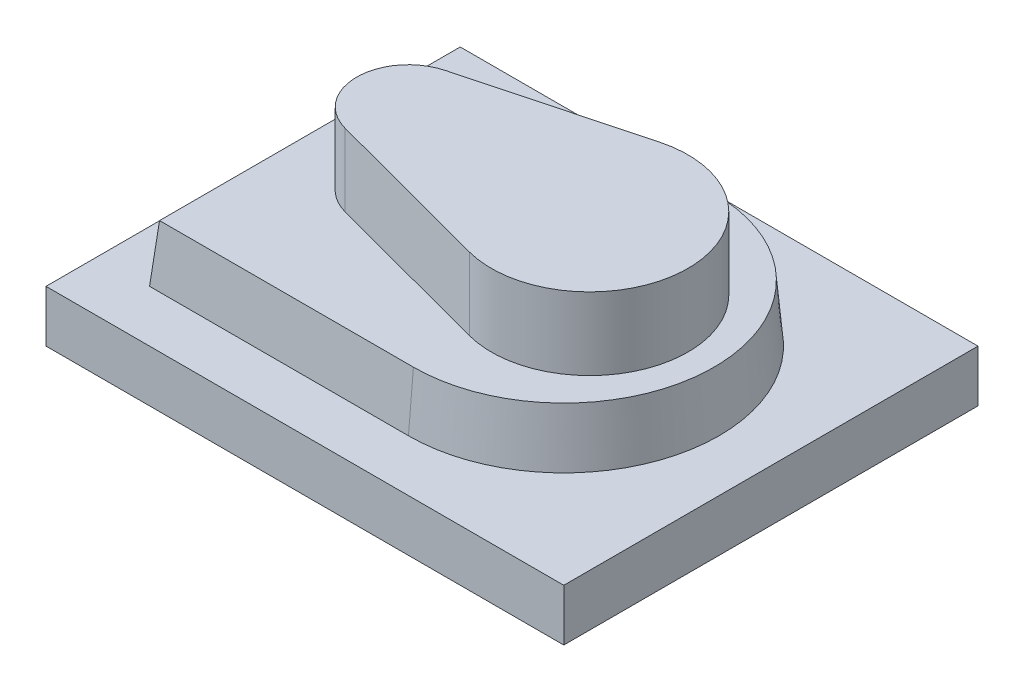
ISO-10303-21;
HEADER;
FILE_DESCRIPTION(('STEP AP214'),'2;1');
FILE_NAME('part.step','',(''),(''),'','','');
FILE_SCHEMA(('AUTOMOTIVE_DESIGN { 1 0 10303 214 1 1 1 1 }'));
ENDSEC;
DATA;
#1=APPLICATION_CONTEXT('core data for automotive mechanical design processes');
#2=APPLICATION_PROTOCOL_DEFINITION('international standard','automotive_design',2000,#1);
#3=PRODUCT_CONTEXT('',#1,'mechanical');
#4=PRODUCT('Part','Part','',(#3));
#5=PRODUCT_RELATED_PRODUCT_CATEGORY('part','',(#4));
#6=PRODUCT_DEFINITION_FORMATION('','',#4);
#7=PRODUCT_DEFINITION_CONTEXT('part definition',#1,'design');
#8=PRODUCT_DEFINITION('design','',#6,#7);
#9=PRODUCT_DEFINITION_SHAPE('','',#8);
#10=(LENGTH_UNIT() NAMED_UNIT(*) SI_UNIT(.MILLI.,.METRE.));
#11=(NAMED_UNIT(*) PLANE_ANGLE_UNIT() SI_UNIT($,.RADIAN.));
#12=(NAMED_UNIT(*) SI_UNIT($,.STERADIAN.) SOLID_ANGLE_UNIT());
#13=UNCERTAINTY_MEASURE_WITH_UNIT(LENGTH_MEASURE(1.E-05),#10,'distance_accuracy_value','');
#14=(GEOMETRIC_REPRESENTATION_CONTEXT(3) GLOBAL_UNCERTAINTY_ASSIGNED_CONTEXT((#13)) GLOBAL_UNIT_ASSIGNED_CONTEXT((#10,
#11,#12)) REPRESENTATION_CONTEXT('',''));
#15=CARTESIAN_POINT('',(0.,0.,0.));
#16=DIRECTION('',(0.,0.,1.));
#17=DIRECTION('',(1.,0.,0.));
#18=AXIS2_PLACEMENT_3D('',#15,#16,#17);
#19=CARTESIAN_POINT('',(50.,10.,-40.));
#20=DIRECTION('',(-1.,0.,0.));
#21=DIRECTION('',(0.,0.,1.));
#22=AXIS2_PLACEMENT_3D('',#19,#20,#21);
#23=PLANE('',#22);
#24=DIRECTION('',(0.,0.,-1.));
#25=VECTOR('',#24,1.);
#26=CARTESIAN_POINT('',(50.,0.,-40.));
#27=LINE('',#26,#25);
#28=CARTESIAN_POINT('',(50.,0.,40.));
#29=VERTEX_POINT('',#28);
#30=CARTESIAN_POINT('',(50.,0.,-40.));
#31=VERTEX_POINT('',#30);
#32=EDGE_CURVE('E166',#29,#31,#27,.T.);
#33=ORIENTED_EDGE('',*,*,#32,.T.);
#34=DIRECTION('',(0.,-1.,0.));
#35=VECTOR('',#34,1.);
#36=CARTESIAN_POINT('',(50.,10.,-40.));
#37=LINE('',#36,#35);
#38=CARTESIAN_POINT('',(50.,10.,-40.));
#39=VERTEX_POINT('',#38);
#40=EDGE_CURVE('E11',#39,#31,#37,.T.);
#41=ORIENTED_EDGE('',*,*,#40,.F.);
#42=DIRECTION('',(0.,0.,-1.));
#43=VECTOR('',#42,1.);
#44=CARTESIAN_POINT('',(50.,10.,-40.));
#45=LINE('',#44,#43);
#46=CARTESIAN_POINT('',(50.,10.,40.));
#47=VERTEX_POINT('',#46);
#48=EDGE_CURVE('E184',#47,#39,#45,.T.);
#49=ORIENTED_EDGE('',*,*,#48,.F.);
#50=DIRECTION('',(0.,-1.,0.));
#51=VECTOR('',#50,1.);
#52=CARTESIAN_POINT('',(50.,10.,40.));
#53=LINE('',#52,#51);
#54=EDGE_CURVE('E194',#47,#29,#53,.T.);
#55=ORIENTED_EDGE('',*,*,#54,.T.);
#56=EDGE_LOOP('',(#33,#41,#49,#55));
#57=FACE_BOUND('',#56,.T.);
#58=ADVANCED_FACE('F37',(#57),#23,.F.);
#59=CARTESIAN_POINT('',(-50.,10.,-40.));
#60=DIRECTION('',(0.,0.,1.));
#61=DIRECTION('',(1.,0.,0.));
#62=AXIS2_PLACEMENT_3D('',#59,#60,#61);
#63=PLANE('',#62);
#64=DIRECTION('',(-1.,0.,0.));
#65=VECTOR('',#64,1.);
#66=CARTESIAN_POINT('',(-50.,0.,-40.));
#67=LINE('',#66,#65);
#68=CARTESIAN_POINT('',(-50.,0.,-40.));
#69=VERTEX_POINT('',#68);
#70=EDGE_CURVE('E197',#31,#69,#67,.T.);
#71=ORIENTED_EDGE('',*,*,#70,.T.);
#72=DIRECTION('',(0.,-1.,0.));
#73=VECTOR('',#72,1.);
#74=CARTESIAN_POINT('',(-50.,10.,-40.));
#75=LINE('',#74,#73);
#76=CARTESIAN_POINT('',(-50.,10.,-40.));
#77=VERTEX_POINT('',#76);
#78=EDGE_CURVE('E44',#77,#69,#75,.T.);
#79=ORIENTED_EDGE('',*,*,#78,.F.);
#80=DIRECTION('',(-1.,0.,0.));
#81=VECTOR('',#80,1.);
#82=CARTESIAN_POINT('',(-50.,10.,-40.));
#83=LINE('',#82,#81);
#84=EDGE_CURVE('E187',#39,#77,#83,.T.);
#85=ORIENTED_EDGE('',*,*,#84,.F.);
#86=ORIENTED_EDGE('',*,*,#40,.T.);
#87=EDGE_LOOP('',(#71,#79,#85,#86));
#88=FACE_BOUND('',#87,.T.);
#89=ADVANCED_FACE('F227',(#88),#63,.F.);
#90=CARTESIAN_POINT('',(-50.,10.,-40.));
#91=DIRECTION('',(1.,0.,0.));
#92=DIRECTION('',(0.,0.,-1.));
#93=AXIS2_PLACEMENT_3D('',#90,#91,#92);
#94=PLANE('',#93);
#95=DIRECTION('',(0.,0.,1.));
#96=VECTOR('',#95,1.);
#97=CARTESIAN_POINT('',(-50.,0.,-40.));
#98=LINE('',#97,#96);
#99=CARTESIAN_POINT('',(-50.,0.,40.));
#100=VERTEX_POINT('',#99);
#101=EDGE_CURVE('E199',#69,#100,#98,.T.);
#102=ORIENTED_EDGE('',*,*,#101,.T.);
#103=DIRECTION('',(0.,-1.,0.));
#104=VECTOR('',#103,1.);
#105=CARTESIAN_POINT('',(-50.,10.,40.));
#106=LINE('',#105,#104);
#107=CARTESIAN_POINT('',(-50.,10.,40.));
#108=VERTEX_POINT('',#107);
#109=EDGE_CURVE('E204',#108,#100,#106,.T.);
#110=ORIENTED_EDGE('',*,*,#109,.F.);
#111=DIRECTION('',(0.,0.,1.));
#112=VECTOR('',#111,1.);
#113=CARTESIAN_POINT('',(-50.,10.,-40.));
#114=LINE('',#113,#112);
#115=EDGE_CURVE('E190',#77,#108,#114,.T.);
#116=ORIENTED_EDGE('',*,*,#115,.F.);
#117=ORIENTED_EDGE('',*,*,#78,.T.);
#118=EDGE_LOOP('',(#102,#110,#116,#117));
#119=FACE_BOUND('',#118,.T.);
#120=ADVANCED_FACE('F211',(#119),#94,.F.);
#121=CARTESIAN_POINT('',(-50.,10.,40.));
#122=DIRECTION('',(0.,0.,-1.));
#123=DIRECTION('',(-1.,0.,0.));
#124=AXIS2_PLACEMENT_3D('',#121,#122,#123);
#125=PLANE('',#124);
#126=DIRECTION('',(1.,0.,0.));
#127=VECTOR('',#126,1.);
#128=CARTESIAN_POINT('',(-50.,0.,40.));
#129=LINE('',#128,#127);
#130=EDGE_CURVE('E188',#100,#29,#129,.T.);
#131=ORIENTED_EDGE('',*,*,#130,.T.);
#132=ORIENTED_EDGE('',*,*,#54,.F.);
#133=DIRECTION('',(1.,0.,0.));
#134=VECTOR('',#133,1.);
#135=CARTESIAN_POINT('',(-50.,10.,40.));
#136=LINE('',#135,#134);
#137=EDGE_CURVE('E192',#108,#47,#136,.T.);
#138=ORIENTED_EDGE('',*,*,#137,.F.);
#139=ORIENTED_EDGE('',*,*,#109,.T.);
#140=EDGE_LOOP('',(#131,#132,#138,#139));
#141=FACE_BOUND('',#140,.T.);
#142=ADVANCED_FACE('F220',(#141),#125,.F.);
#143=CARTESIAN_POINT('',(0.,10.,0.));
#144=DIRECTION('',(0.,1.,0.));
#145=DIRECTION('',(0.,0.,1.));
#146=AXIS2_PLACEMENT_3D('',#143,#144,#145);
#147=PLANE('',#146);
#148=CARTESIAN_POINT('',(10.,10.,0.));
#149=DIRECTION('',(0.,1.,0.));
#150=DIRECTION('',(0.,0.,1.));
#151=AXIS2_PLACEMENT_3D('',#148,#149,#150);
#152=CIRCLE('',#151,30.);
#153=CARTESIAN_POINT('',(10.,10.,30.));
#154=VERTEX_POINT('',#153);
#155=CARTESIAN_POINT('',(10.,10.,-30.));
#156=VERTEX_POINT('',#155);
#157=EDGE_CURVE('E145',#154,#156,#152,.T.);
#158=ORIENTED_EDGE('',*,*,#157,.F.);
#159=DIRECTION('',(1.,0.,0.));
#160=VECTOR('',#159,1.);
#161=CARTESIAN_POINT('',(-40.,10.,30.));
#162=LINE('',#161,#160);
#163=CARTESIAN_POINT('',(-40.,10.,30.));
#164=VERTEX_POINT('',#163);
#165=EDGE_CURVE('E159',#164,#154,#162,.T.);
#166=ORIENTED_EDGE('',*,*,#165,.F.);
#167=DIRECTION('',(0.,0.,1.));
#168=VECTOR('',#167,1.);
#169=CARTESIAN_POINT('',(-40.,10.,-30.));
#170=LINE('',#169,#168);
#171=CARTESIAN_POINT('',(-40.,10.,-30.));
#172=VERTEX_POINT('',#171);
#173=EDGE_CURVE('E156',#172,#164,#170,.T.);
#174=ORIENTED_EDGE('',*,*,#173,.F.);
#175=DIRECTION('',(-1.,0.,0.));
#176=VECTOR('',#175,1.);
#177=CARTESIAN_POINT('',(10.,10.,-30.));
#178=LINE('',#177,#176);
#179=EDGE_CURVE('E148',#156,#172,#178,.T.);
#180=ORIENTED_EDGE('',*,*,#179,.F.);
#181=EDGE_LOOP('',(#158,#166,#174,#180));
#182=FACE_BOUND('',#181,.T.);
#183=ORIENTED_EDGE('',*,*,#48,.T.);
#184=ORIENTED_EDGE('',*,*,#84,.T.);
#185=ORIENTED_EDGE('',*,*,#115,.T.);
#186=ORIENTED_EDGE('',*,*,#137,.T.);
#187=EDGE_LOOP('',(#183,#184,#185,#186));
#188=FACE_BOUND('',#187,.T.);
#189=ADVANCED_FACE('F226',(#182,#188),#147,.T.);
#190=CARTESIAN_POINT('',(0.,0.,0.));
#191=DIRECTION('',(0.,1.,0.));
#192=DIRECTION('',(0.,0.,1.));
#193=AXIS2_PLACEMENT_3D('',#190,#191,#192);
#194=PLANE('',#193);
#195=ORIENTED_EDGE('',*,*,#32,.F.);
#196=ORIENTED_EDGE('',*,*,#130,.F.);
#197=ORIENTED_EDGE('',*,*,#101,.F.);
#198=ORIENTED_EDGE('',*,*,#70,.F.);
#199=EDGE_LOOP('',(#195,#196,#197,#198));
#200=FACE_BOUND('',#199,.T.);
#201=ADVANCED_FACE('F217',(#200),#194,.F.);
#202=CARTESIAN_POINT('',(10.,10.,0.));
#203=DIRECTION('',(0.,-1.,0.));
#204=DIRECTION('',(0.,0.,1.));
#205=AXIS2_PLACEMENT_3D('',#202,#203,#204);
#206=CONICAL_SURFACE('',#205,30.,0.0872664625997167);
#207=ORIENTED_EDGE('',*,*,#157,.T.);
#208=DIRECTION('',(0.,-0.996194698091745,-0.0871557427476583));
#209=VECTOR('',#208,1.);
#210=CARTESIAN_POINT('',(10.,10.,-30.));
#211=LINE('',#210,#209);
#212=CARTESIAN_POINT('',(10.,21.,-29.0376247012148));
#213=VERTEX_POINT('',#212);
#214=EDGE_CURVE('E163',#213,#156,#211,.T.);
#215=ORIENTED_EDGE('',*,*,#214,.F.);
#216=CARTESIAN_POINT('',(10.,21.,0.));
#217=DIRECTION('',(0.,1.,0.));
#218=DIRECTION('',(0.,0.,1.));
#219=AXIS2_PLACEMENT_3D('',#216,#217,#218);
#220=CIRCLE('',#219,29.0376247012148);
#221=CARTESIAN_POINT('',(10.,21.,29.0376247012148));
#222=VERTEX_POINT('',#221);
#223=EDGE_CURVE('E162',#222,#213,#220,.T.);
#224=ORIENTED_EDGE('',*,*,#223,.F.);
#225=DIRECTION('',(0.,-0.996194698091745,0.0871557427476583));
#226=VECTOR('',#225,1.);
#227=CARTESIAN_POINT('',(10.,10.,30.));
#228=LINE('',#227,#226);
#229=EDGE_CURVE('E168',#222,#154,#228,.T.);
#230=ORIENTED_EDGE('',*,*,#229,.T.);
#231=EDGE_LOOP('',(#207,#215,#224,#230));
#232=FACE_BOUND('',#231,.T.);
#233=ADVANCED_FACE('F239',(#232),#206,.T.);
#234=CARTESIAN_POINT('',(10.,10.,-30.));
#235=DIRECTION('',(0.,0.0871557427476584,-0.996194698091745));
#236=DIRECTION('',(0.,0.996194698091746,0.0871557427476584));
#237=AXIS2_PLACEMENT_3D('',#234,#235,#236);
#238=PLANE('',#237);
#239=ORIENTED_EDGE('',*,*,#179,.T.);
#240=DIRECTION('',(-0.0868265938642478,-0.992432509138967,-0.0868265938642478));
#241=VECTOR('',#240,1.);
#242=CARTESIAN_POINT('',(-40.,10.,-30.));
#243=LINE('',#242,#241);
#244=CARTESIAN_POINT('',(-39.0376247012148,21.,-29.0376247012148));
#245=VERTEX_POINT('',#244);
#246=EDGE_CURVE('E167',#245,#172,#243,.T.);
#247=ORIENTED_EDGE('',*,*,#246,.F.);
#248=DIRECTION('',(1.,0.,0.));
#249=VECTOR('',#248,1.);
#250=CARTESIAN_POINT('',(10.,21.,-29.0376247012148));
#251=LINE('',#250,#249);
#252=EDGE_CURVE('E179',#213,#245,#251,.F.);
#253=ORIENTED_EDGE('',*,*,#252,.F.);
#254=ORIENTED_EDGE('',*,*,#214,.T.);
#255=EDGE_LOOP('',(#239,#247,#253,#254));
#256=FACE_BOUND('',#255,.T.);
#257=ADVANCED_FACE('F243',(#256),#238,.T.);
#258=CARTESIAN_POINT('',(-40.,10.,-30.));
#259=DIRECTION('',(-0.996194698091746,0.0871557427476584,0.));
#260=DIRECTION('',(-0.0871557427476584,-0.996194698091746,0.));
#261=AXIS2_PLACEMENT_3D('',#258,#259,#260);
#262=PLANE('',#261);
#263=ORIENTED_EDGE('',*,*,#173,.T.);
#264=DIRECTION('',(-0.0868265938642478,-0.992432509138967,0.0868265938642478));
#265=VECTOR('',#264,1.);
#266=CARTESIAN_POINT('',(-40.,10.,30.));
#267=LINE('',#266,#265);
#268=CARTESIAN_POINT('',(-39.0376247012148,21.,29.0376247012148));
#269=VERTEX_POINT('',#268);
#270=EDGE_CURVE('E171',#269,#164,#267,.T.);
#271=ORIENTED_EDGE('',*,*,#270,.F.);
#272=DIRECTION('',(0.,0.,-1.));
#273=VECTOR('',#272,1.);
#274=CARTESIAN_POINT('',(-39.0376247012148,21.,-30.));
#275=LINE('',#274,#273);
#276=EDGE_CURVE('E181',#245,#269,#275,.F.);
#277=ORIENTED_EDGE('',*,*,#276,.F.);
#278=ORIENTED_EDGE('',*,*,#246,.T.);
#279=EDGE_LOOP('',(#263,#271,#277,#278));
#280=FACE_BOUND('',#279,.T.);
#281=ADVANCED_FACE('F246',(#280),#262,.T.);
#282=CARTESIAN_POINT('',(-40.,10.,30.));
#283=DIRECTION('',(0.,0.0871557427476584,0.996194698091746));
#284=DIRECTION('',(0.,-0.996194698091746,0.0871557427476584));
#285=AXIS2_PLACEMENT_3D('',#282,#283,#284);
#286=PLANE('',#285);
#287=ORIENTED_EDGE('',*,*,#165,.T.);
#288=ORIENTED_EDGE('',*,*,#229,.F.);
#289=DIRECTION('',(-1.,0.,0.));
#290=VECTOR('',#289,1.);
#291=CARTESIAN_POINT('',(-40.,21.,29.0376247012148));
#292=LINE('',#291,#290);
#293=EDGE_CURVE('E172',#269,#222,#292,.F.);
#294=ORIENTED_EDGE('',*,*,#293,.F.);
#295=ORIENTED_EDGE('',*,*,#270,.T.);
#296=EDGE_LOOP('',(#287,#288,#294,#295));
#297=FACE_BOUND('',#296,.T.);
#298=ADVANCED_FACE('F250',(#297),#286,.T.);
#299=CARTESIAN_POINT('',(10.,21.,0.));
#300=DIRECTION('',(0.,1.,0.));
#301=DIRECTION('',(0.,0.,1.));
#302=AXIS2_PLACEMENT_3D('',#299,#300,#301);
#303=PLANE('',#302);
#304=CARTESIAN_POINT('',(-20.,21.,0.));
#305=DIRECTION('',(0.,1.,0.));
#306=DIRECTION('',(0.,0.,1.));
#307=AXIS2_PLACEMENT_3D('',#304,#305,#306);
#308=CIRCLE('',#307,10.);
#309=CARTESIAN_POINT('',(-22.5714285714286,21.,-9.66373401445015));
#310=VERTEX_POINT('',#309);
#311=CARTESIAN_POINT('',(-22.5714285714286,21.,9.66373401445015));
#312=VERTEX_POINT('',#311);
#313=EDGE_CURVE('E51',#310,#312,#308,.T.);
#314=ORIENTED_EDGE('',*,*,#313,.F.);
#315=DIRECTION('',(-0.966373401445015,0.,0.257142857142857));
#316=VECTOR('',#315,1.);
#317=CARTESIAN_POINT('',(-22.5714285714286,21.,-9.66373401445015));
#318=LINE('',#317,#316);
#319=CARTESIAN_POINT('',(10.1142857142857,21.,-18.3610946274553));
#320=VERTEX_POINT('',#319);
#321=EDGE_CURVE('E55',#320,#310,#318,.T.);
#322=ORIENTED_EDGE('',*,*,#321,.F.);
#323=CARTESIAN_POINT('',(15.,21.,0.));
#324=DIRECTION('',(0.,1.,0.));
#325=DIRECTION('',(0.,0.,1.));
#326=AXIS2_PLACEMENT_3D('',#323,#324,#325);
#327=CIRCLE('',#326,19.);
#328=CARTESIAN_POINT('',(10.1142857142857,21.,18.3610946274553));
#329=VERTEX_POINT('',#328);
#330=EDGE_CURVE('E371',#329,#320,#327,.T.);
#331=ORIENTED_EDGE('',*,*,#330,.F.);
#332=DIRECTION('',(0.966373401445015,0.,0.257142857142857));
#333=VECTOR('',#332,1.);
#334=CARTESIAN_POINT('',(-22.5714285714286,21.,9.66373401445015));
#335=LINE('',#334,#333);
#336=EDGE_CURVE('E377',#312,#329,#335,.T.);
#337=ORIENTED_EDGE('',*,*,#336,.F.);
#338=EDGE_LOOP('',(#314,#322,#331,#337));
#339=FACE_BOUND('',#338,.T.);
#340=ORIENTED_EDGE('',*,*,#223,.T.);
#341=ORIENTED_EDGE('',*,*,#252,.T.);
#342=ORIENTED_EDGE('',*,*,#276,.T.);
#343=ORIENTED_EDGE('',*,*,#293,.T.);
#344=EDGE_LOOP('',(#340,#341,#342,#343));
#345=FACE_BOUND('',#344,.T.);
#346=ADVANCED_FACE('F254',(#339,#345),#303,.T.);
#347=CARTESIAN_POINT('',(-20.,35.,0.));
#348=DIRECTION('',(0.,-1.,0.));
#349=DIRECTION('',(0.,0.,-1.));
#350=AXIS2_PLACEMENT_3D('',#347,#348,#349);
#351=CYLINDRICAL_SURFACE('',#350,10.);
#352=ORIENTED_EDGE('',*,*,#313,.T.);
#353=DIRECTION('',(0.,-1.,0.));
#354=VECTOR('',#353,1.);
#355=CARTESIAN_POINT('',(-22.5714285714286,35.,9.66373401445015));
#356=LINE('',#355,#354);
#357=CARTESIAN_POINT('',(-22.5714285714286,35.,9.66373401445015));
#358=VERTEX_POINT('',#357);
#359=EDGE_CURVE('E128',#358,#312,#356,.T.);
#360=ORIENTED_EDGE('',*,*,#359,.F.);
#361=CARTESIAN_POINT('',(-20.,35.,0.));
#362=DIRECTION('',(0.,1.,0.));
#363=DIRECTION('',(0.,0.,1.));
#364=AXIS2_PLACEMENT_3D('',#361,#362,#363);
#365=CIRCLE('',#364,10.);
#366=CARTESIAN_POINT('',(-22.5714285714286,35.,-9.66373401445015));
#367=VERTEX_POINT('',#366);
#368=EDGE_CURVE('E134',#367,#358,#365,.T.);
#369=ORIENTED_EDGE('',*,*,#368,.F.);
#370=DIRECTION('',(0.,-1.,0.));
#371=VECTOR('',#370,1.);
#372=CARTESIAN_POINT('',(-22.5714285714286,35.,-9.66373401445015));
#373=LINE('',#372,#371);
#374=EDGE_CURVE('E369',#367,#310,#373,.T.);
#375=ORIENTED_EDGE('',*,*,#374,.T.);
#376=EDGE_LOOP('',(#352,#360,#369,#375));
#377=FACE_BOUND('',#376,.T.);
#378=ADVANCED_FACE('F144',(#377),#351,.T.);
#379=CARTESIAN_POINT('',(-22.5714285714286,35.,9.66373401445015));
#380=DIRECTION('',(0.257142857142857,0.,-0.966373401445015));
#381=DIRECTION('',(-0.966373401445015,0.,-0.257142857142857));
#382=AXIS2_PLACEMENT_3D('',#379,#380,#381);
#383=PLANE('',#382);
#384=ORIENTED_EDGE('',*,*,#336,.T.);
#385=DIRECTION('',(0.,-1.,0.));
#386=VECTOR('',#385,1.);
#387=CARTESIAN_POINT('',(10.1142857142857,35.,18.3610946274553));
#388=LINE('',#387,#386);
#389=CARTESIAN_POINT('',(10.1142857142857,35.,18.3610946274553));
#390=VERTEX_POINT('',#389);
#391=EDGE_CURVE('E130',#390,#329,#388,.T.);
#392=ORIENTED_EDGE('',*,*,#391,.F.);
#393=DIRECTION('',(0.966373401445015,0.,0.257142857142857));
#394=VECTOR('',#393,1.);
#395=CARTESIAN_POINT('',(-22.5714285714286,35.,9.66373401445015));
#396=LINE('',#395,#394);
#397=EDGE_CURVE('E123',#358,#390,#396,.T.);
#398=ORIENTED_EDGE('',*,*,#397,.F.);
#399=ORIENTED_EDGE('',*,*,#359,.T.);
#400=EDGE_LOOP('',(#384,#392,#398,#399));
#401=FACE_BOUND('',#400,.T.);
#402=ADVANCED_FACE('F126',(#401),#383,.F.);
#403=CARTESIAN_POINT('',(15.,35.,0.));
#404=DIRECTION('',(0.,-1.,0.));
#405=DIRECTION('',(0.,0.,-1.));
#406=AXIS2_PLACEMENT_3D('',#403,#404,#405);
#407=CYLINDRICAL_SURFACE('',#406,19.);
#408=ORIENTED_EDGE('',*,*,#330,.T.);
#409=DIRECTION('',(0.,-1.,0.));
#410=VECTOR('',#409,1.);
#411=CARTESIAN_POINT('',(10.1142857142857,35.,-18.3610946274553));
#412=LINE('',#411,#410);
#413=CARTESIAN_POINT('',(10.1142857142857,35.,-18.3610946274553));
#414=VERTEX_POINT('',#413);
#415=EDGE_CURVE('E150',#414,#320,#412,.T.);
#416=ORIENTED_EDGE('',*,*,#415,.F.);
#417=CARTESIAN_POINT('',(15.,35.,0.));
#418=DIRECTION('',(0.,1.,0.));
#419=DIRECTION('',(0.,0.,1.));
#420=AXIS2_PLACEMENT_3D('',#417,#418,#419);
#421=CIRCLE('',#420,19.);
#422=EDGE_CURVE('E133',#390,#414,#421,.T.);
#423=ORIENTED_EDGE('',*,*,#422,.F.);
#424=ORIENTED_EDGE('',*,*,#391,.T.);
#425=EDGE_LOOP('',(#408,#416,#423,#424));
#426=FACE_BOUND('',#425,.T.);
#427=ADVANCED_FACE('F265',(#426),#407,.T.);
#428=CARTESIAN_POINT('',(-22.5714285714286,35.,-9.66373401445015));
#429=DIRECTION('',(0.257142857142857,0.,0.966373401445015));
#430=DIRECTION('',(0.966373401445015,0.,-0.257142857142857));
#431=AXIS2_PLACEMENT_3D('',#428,#429,#430);
#432=PLANE('',#431);
#433=ORIENTED_EDGE('',*,*,#321,.T.);
#434=ORIENTED_EDGE('',*,*,#374,.F.);
#435=DIRECTION('',(-0.966373401445015,0.,0.257142857142857));
#436=VECTOR('',#435,1.);
#437=CARTESIAN_POINT('',(-22.5714285714286,35.,-9.66373401445015));
#438=LINE('',#437,#436);
#439=EDGE_CURVE('E139',#414,#367,#438,.T.);
#440=ORIENTED_EDGE('',*,*,#439,.F.);
#441=ORIENTED_EDGE('',*,*,#415,.T.);
#442=EDGE_LOOP('',(#433,#434,#440,#441));
#443=FACE_BOUND('',#442,.T.);
#444=ADVANCED_FACE('F268',(#443),#432,.F.);
#445=CARTESIAN_POINT('',(-20.,35.,0.));
#446=DIRECTION('',(0.,1.,0.));
#447=DIRECTION('',(0.,0.,1.));
#448=AXIS2_PLACEMENT_3D('',#445,#446,#447);
#449=PLANE('',#448);
#450=ORIENTED_EDGE('',*,*,#368,.T.);
#451=ORIENTED_EDGE('',*,*,#397,.T.);
#452=ORIENTED_EDGE('',*,*,#422,.T.);
#453=ORIENTED_EDGE('',*,*,#439,.T.);
#454=EDGE_LOOP('',(#450,#451,#452,#453));
#455=FACE_BOUND('',#454,.T.);
#456=ADVANCED_FACE('F137',(#455),#449,.T.);
#457=CLOSED_SHELL('',(#58,#89,#120,#142,#189,#201,#233,#257,#281,#298,#346,#378,#402,#427,#444,#456));
#458=MANIFOLD_SOLID_BREP('B2',#457);
#459=ADVANCED_BREP_SHAPE_REPRESENTATION('',(#18,#458),#14);
#460=SHAPE_DEFINITION_REPRESENTATION(#9,#459);
ENDSEC;
END-ISO-10303-21;
